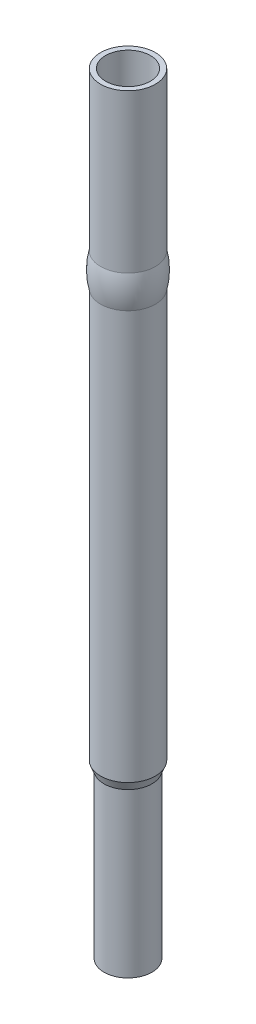
ISO-10303-21;
HEADER;
FILE_DESCRIPTION(('STEP AP214'),'2;1');
FILE_NAME('part.step','',(''),(''),'','','');
FILE_SCHEMA(('AUTOMOTIVE_DESIGN { 1 0 10303 214 1 1 1 1 }'));
ENDSEC;
DATA;
#1=APPLICATION_CONTEXT('core data for automotive mechanical design processes');
#2=APPLICATION_PROTOCOL_DEFINITION('international standard','automotive_design',2000,#1);
#3=PRODUCT_CONTEXT('',#1,'mechanical');
#4=PRODUCT('Part','Part','',(#3));
#5=PRODUCT_RELATED_PRODUCT_CATEGORY('part','',(#4));
#6=PRODUCT_DEFINITION_FORMATION('','',#4);
#7=PRODUCT_DEFINITION_CONTEXT('part definition',#1,'design');
#8=PRODUCT_DEFINITION('design','',#6,#7);
#9=PRODUCT_DEFINITION_SHAPE('','',#8);
#10=(LENGTH_UNIT() NAMED_UNIT(*) SI_UNIT(.MILLI.,.METRE.));
#11=(NAMED_UNIT(*) PLANE_ANGLE_UNIT() SI_UNIT($,.RADIAN.));
#12=(NAMED_UNIT(*) SI_UNIT($,.STERADIAN.) SOLID_ANGLE_UNIT());
#13=UNCERTAINTY_MEASURE_WITH_UNIT(LENGTH_MEASURE(1.E-05),#10,'distance_accuracy_value','');
#14=(GEOMETRIC_REPRESENTATION_CONTEXT(3) GLOBAL_UNCERTAINTY_ASSIGNED_CONTEXT((#13)) GLOBAL_UNIT_ASSIGNED_CONTEXT((#10,
#11,#12)) REPRESENTATION_CONTEXT('',''));
#15=CARTESIAN_POINT('',(0.,0.,0.));
#16=DIRECTION('',(0.,0.,1.));
#17=DIRECTION('',(1.,0.,0.));
#18=AXIS2_PLACEMENT_3D('',#15,#16,#17);
#19=CARTESIAN_POINT('',(0.,0.,-0.84));
#20=DIRECTION('',(0.,-1.,0.));
#21=DIRECTION('',(0.,0.,-1.));
#22=AXIS2_PLACEMENT_3D('',#19,#20,#21);
#23=PLANE('',#22);
#24=CARTESIAN_POINT('',(0.,0.,0.));
#25=DIRECTION('',(0.,1.,0.));
#26=DIRECTION('',(0.,0.,1.));
#27=AXIS2_PLACEMENT_3D('',#24,#25,#26);
#28=CIRCLE('',#27,0.685000000000002);
#29=CARTESIAN_POINT('',(0.,0.,0.685000000000003));
#30=VERTEX_POINT('',#29);
#31=EDGE_CURVE('E67',#30,#30,#28,.T.);
#32=ORIENTED_EDGE('',*,*,#31,.F.);
#33=EDGE_LOOP('',(#32));
#34=FACE_BOUND('',#33,.T.);
#35=CARTESIAN_POINT('',(0.,0.,0.));
#36=DIRECTION('',(0.,1.,0.));
#37=DIRECTION('',(0.,0.,1.));
#38=AXIS2_PLACEMENT_3D('',#35,#36,#37);
#39=CIRCLE('',#38,0.840000000000002);
#40=CARTESIAN_POINT('',(0.,0.,0.840000000000003));
#41=VERTEX_POINT('',#40);
#42=EDGE_CURVE('E10',#41,#41,#39,.T.);
#43=ORIENTED_EDGE('',*,*,#42,.T.);
#44=EDGE_LOOP('',(#43));
#45=FACE_BOUND('',#44,.T.);
#46=ADVANCED_FACE('F33',(#34,#45),#23,.F.);
#47=CARTESIAN_POINT('',(0.,-14.48,0.));
#48=DIRECTION('',(0.,1.,0.));
#49=DIRECTION('',(0.,0.,1.));
#50=AXIS2_PLACEMENT_3D('',#47,#48,#49);
#51=CYLINDRICAL_SURFACE('',#50,0.840000000000002);
#52=ORIENTED_EDGE('',*,*,#42,.F.);
#53=EDGE_LOOP('',(#52));
#54=FACE_BOUND('',#53,.T.);
#55=CARTESIAN_POINT('',(0.,-4.84,0.));
#56=DIRECTION('',(0.,1.,0.));
#57=DIRECTION('',(0.,0.,1.));
#58=AXIS2_PLACEMENT_3D('',#55,#56,#57);
#59=CIRCLE('',#58,0.840000000000002);
#60=CARTESIAN_POINT('',(0.,-4.84,0.840000000000003));
#61=VERTEX_POINT('',#60);
#62=EDGE_CURVE('E39',#61,#61,#59,.T.);
#63=ORIENTED_EDGE('',*,*,#62,.T.);
#64=EDGE_LOOP('',(#63));
#65=FACE_BOUND('',#64,.T.);
#66=ADVANCED_FACE('F74',(#54,#65),#51,.T.);
#67=CARTESIAN_POINT('',(0.,-5.34,0.));
#68=DIRECTION('',(0.,1.,0.));
#69=DIRECTION('',(0.,0.,1.));
#70=AXIS2_PLACEMENT_3D('',#67,#68,#69);
#71=DEGENERATE_TOROIDAL_SURFACE('',#70,1.21333333333331,2.11333333333331,.F.);
#72=ORIENTED_EDGE('',*,*,#62,.F.);
#73=EDGE_LOOP('',(#72));
#74=FACE_BOUND('',#73,.T.);
#75=CARTESIAN_POINT('',(0.,-5.84,0.));
#76=DIRECTION('',(0.,1.,0.));
#77=DIRECTION('',(0.,0.,1.));
#78=AXIS2_PLACEMENT_3D('',#75,#76,#77);
#79=CIRCLE('',#78,0.840000000000001);
#80=CARTESIAN_POINT('',(0.,-5.84,0.840000000000002));
#81=VERTEX_POINT('',#80);
#82=EDGE_CURVE('E43',#81,#81,#79,.T.);
#83=ORIENTED_EDGE('',*,*,#82,.T.);
#84=EDGE_LOOP('',(#83));
#85=FACE_BOUND('',#84,.T.);
#86=ADVANCED_FACE('F78',(#74,#85),#71,.F.);
#87=CARTESIAN_POINT('',(0.,-14.48,0.));
#88=DIRECTION('',(0.,1.,0.));
#89=DIRECTION('',(0.,0.,1.));
#90=AXIS2_PLACEMENT_3D('',#87,#88,#89);
#91=CYLINDRICAL_SURFACE('',#90,0.84);
#92=ORIENTED_EDGE('',*,*,#82,.F.);
#93=EDGE_LOOP('',(#92));
#94=FACE_BOUND('',#93,.T.);
#95=CARTESIAN_POINT('',(0.,-18.36,0.));
#96=DIRECTION('',(0.,1.,0.));
#97=DIRECTION('',(0.,0.,1.));
#98=AXIS2_PLACEMENT_3D('',#95,#96,#97);
#99=CIRCLE('',#98,0.84);
#100=CARTESIAN_POINT('',(0.,-18.36,0.839999999999999));
#101=VERTEX_POINT('',#100);
#102=EDGE_CURVE('E47',#101,#101,#99,.T.);
#103=ORIENTED_EDGE('',*,*,#102,.T.);
#104=EDGE_LOOP('',(#103));
#105=FACE_BOUND('',#104,.T.);
#106=ADVANCED_FACE('F83',(#94,#105),#91,.T.);
#107=CARTESIAN_POINT('',(0.,-18.62,0.));
#108=DIRECTION('',(0.,1.,0.));
#109=DIRECTION('',(0.,0.,1.));
#110=AXIS2_PLACEMENT_3D('',#107,#108,#109);
#111=CONICAL_SURFACE('',#110,0.735,0.383817623288567);
#112=ORIENTED_EDGE('',*,*,#102,.F.);
#113=EDGE_LOOP('',(#112));
#114=FACE_BOUND('',#113,.T.);
#115=CARTESIAN_POINT('',(0.,-18.62,0.));
#116=DIRECTION('',(0.,1.,0.));
#117=DIRECTION('',(0.,0.,1.));
#118=AXIS2_PLACEMENT_3D('',#115,#116,#117);
#119=CIRCLE('',#118,0.735);
#120=CARTESIAN_POINT('',(0.,-18.62,0.735));
#121=VERTEX_POINT('',#120);
#122=EDGE_CURVE('E52',#121,#121,#119,.T.);
#123=ORIENTED_EDGE('',*,*,#122,.T.);
#124=EDGE_LOOP('',(#123));
#125=FACE_BOUND('',#124,.T.);
#126=ADVANCED_FACE('F89',(#114,#125),#111,.T.);
#127=CARTESIAN_POINT('',(0.,-14.48,0.));
#128=DIRECTION('',(0.,1.,0.));
#129=DIRECTION('',(0.,0.,1.));
#130=AXIS2_PLACEMENT_3D('',#127,#128,#129);
#131=CYLINDRICAL_SURFACE('',#130,0.735);
#132=ORIENTED_EDGE('',*,*,#122,.F.);
#133=EDGE_LOOP('',(#132));
#134=FACE_BOUND('',#133,.T.);
#135=CARTESIAN_POINT('',(0.,-23.62,0.));
#136=DIRECTION('',(0.,1.,0.));
#137=DIRECTION('',(0.,0.,1.));
#138=AXIS2_PLACEMENT_3D('',#135,#136,#137);
#139=CIRCLE('',#138,0.734999999999999);
#140=CARTESIAN_POINT('',(0.,-23.62,0.734999999999998));
#141=VERTEX_POINT('',#140);
#142=EDGE_CURVE('E55',#141,#141,#139,.T.);
#143=ORIENTED_EDGE('',*,*,#142,.T.);
#144=EDGE_LOOP('',(#143));
#145=FACE_BOUND('',#144,.T.);
#146=ADVANCED_FACE('F93',(#134,#145),#131,.T.);
#147=CARTESIAN_POINT('',(0.,-23.62,-0.595000000000002));
#148=DIRECTION('',(0.,1.,0.));
#149=DIRECTION('',(0.,0.,1.));
#150=AXIS2_PLACEMENT_3D('',#147,#148,#149);
#151=PLANE('',#150);
#152=ORIENTED_EDGE('',*,*,#142,.F.);
#153=EDGE_LOOP('',(#152));
#154=FACE_BOUND('',#153,.T.);
#155=CARTESIAN_POINT('',(0.,-23.62,0.));
#156=DIRECTION('',(0.,1.,0.));
#157=DIRECTION('',(0.,0.,1.));
#158=AXIS2_PLACEMENT_3D('',#155,#156,#157);
#159=CIRCLE('',#158,0.595000000000001);
#160=CARTESIAN_POINT('',(0.,-23.62,0.595));
#161=VERTEX_POINT('',#160);
#162=EDGE_CURVE('E58',#161,#161,#159,.T.);
#163=ORIENTED_EDGE('',*,*,#162,.T.);
#164=EDGE_LOOP('',(#163));
#165=FACE_BOUND('',#164,.T.);
#166=ADVANCED_FACE('F97',(#154,#165),#151,.F.);
#167=CARTESIAN_POINT('',(0.,-14.48,0.));
#168=DIRECTION('',(0.,1.,0.));
#169=DIRECTION('',(0.,0.,1.));
#170=AXIS2_PLACEMENT_3D('',#167,#168,#169);
#171=CYLINDRICAL_SURFACE('',#170,0.595);
#172=ORIENTED_EDGE('',*,*,#162,.F.);
#173=EDGE_LOOP('',(#172));
#174=FACE_BOUND('',#173,.T.);
#175=CARTESIAN_POINT('',(0.,-18.62,0.));
#176=DIRECTION('',(0.,1.,0.));
#177=DIRECTION('',(0.,0.,1.));
#178=AXIS2_PLACEMENT_3D('',#175,#176,#177);
#179=CIRCLE('',#178,0.595);
#180=CARTESIAN_POINT('',(0.,-18.62,0.594999999999999));
#181=VERTEX_POINT('',#180);
#182=EDGE_CURVE('E61',#181,#181,#179,.T.);
#183=ORIENTED_EDGE('',*,*,#182,.T.);
#184=EDGE_LOOP('',(#183));
#185=FACE_BOUND('',#184,.T.);
#186=ADVANCED_FACE('F101',(#174,#185),#171,.F.);
#187=CARTESIAN_POINT('',(0.,-18.62,0.));
#188=DIRECTION('',(0.,1.,0.));
#189=DIRECTION('',(0.,0.,1.));
#190=AXIS2_PLACEMENT_3D('',#187,#188,#189);
#191=PLANE('',#190);
#192=ORIENTED_EDGE('',*,*,#182,.F.);
#193=EDGE_LOOP('',(#192));
#194=FACE_BOUND('',#193,.T.);
#195=ADVANCED_FACE('F105',(#194),#191,.F.);
#196=CARTESIAN_POINT('',(0.,-14.48,-0.685000000000002));
#197=DIRECTION('',(0.,-1.,0.));
#198=DIRECTION('',(0.,0.,-1.));
#199=AXIS2_PLACEMENT_3D('',#196,#197,#198);
#200=PLANE('',#199);
#201=CARTESIAN_POINT('',(0.,-14.48,0.));
#202=DIRECTION('',(0.,1.,0.));
#203=DIRECTION('',(0.,0.,1.));
#204=AXIS2_PLACEMENT_3D('',#201,#202,#203);
#205=CIRCLE('',#204,0.685000000000002);
#206=CARTESIAN_POINT('',(0.,-14.48,0.685000000000002));
#207=VERTEX_POINT('',#206);
#208=EDGE_CURVE('E64',#207,#207,#205,.T.);
#209=ORIENTED_EDGE('',*,*,#208,.T.);
#210=EDGE_LOOP('',(#209));
#211=FACE_BOUND('',#210,.T.);
#212=ADVANCED_FACE('F109',(#211),#200,.F.);
#213=CARTESIAN_POINT('',(0.,-14.48,0.));
#214=DIRECTION('',(0.,1.,0.));
#215=DIRECTION('',(0.,0.,1.));
#216=AXIS2_PLACEMENT_3D('',#213,#214,#215);
#217=CYLINDRICAL_SURFACE('',#216,0.685000000000002);
#218=ORIENTED_EDGE('',*,*,#208,.F.);
#219=EDGE_LOOP('',(#218));
#220=FACE_BOUND('',#219,.T.);
#221=ORIENTED_EDGE('',*,*,#31,.T.);
#222=EDGE_LOOP('',(#221));
#223=FACE_BOUND('',#222,.T.);
#224=ADVANCED_FACE('F71',(#220,#223),#217,.F.);
#225=CLOSED_SHELL('',(#46,#66,#86,#106,#126,#146,#166,#186,#195,#212,#224));
#226=MANIFOLD_SOLID_BREP('B2',#225);
#227=ADVANCED_BREP_SHAPE_REPRESENTATION('',(#18,#226),#14);
#228=SHAPE_DEFINITION_REPRESENTATION(#9,#227);
ENDSEC;
END-ISO-10303-21;
